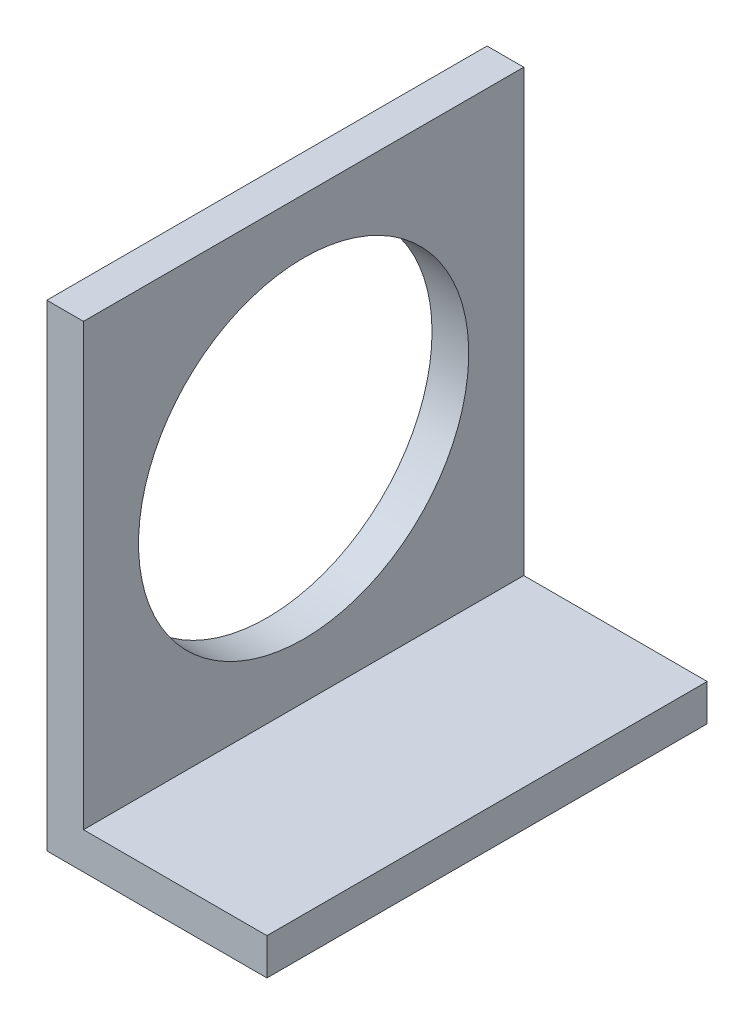
ISO-10303-21;
HEADER;
FILE_DESCRIPTION(('STEP AP214'),'2;1');
FILE_NAME('part.step','',(''),(''),'','','');
FILE_SCHEMA(('AUTOMOTIVE_DESIGN { 1 0 10303 214 1 1 1 1 }'));
ENDSEC;
DATA;
#1=APPLICATION_CONTEXT('core data for automotive mechanical design processes');
#2=APPLICATION_PROTOCOL_DEFINITION('international standard','automotive_design',2000,#1);
#3=PRODUCT_CONTEXT('',#1,'mechanical');
#4=PRODUCT('Part','Part','',(#3));
#5=PRODUCT_RELATED_PRODUCT_CATEGORY('part','',(#4));
#6=PRODUCT_DEFINITION_FORMATION('','',#4);
#7=PRODUCT_DEFINITION_CONTEXT('part definition',#1,'design');
#8=PRODUCT_DEFINITION('design','',#6,#7);
#9=PRODUCT_DEFINITION_SHAPE('','',#8);
#10=(LENGTH_UNIT() NAMED_UNIT(*) SI_UNIT(.MILLI.,.METRE.));
#11=(NAMED_UNIT(*) PLANE_ANGLE_UNIT() SI_UNIT($,.RADIAN.));
#12=(NAMED_UNIT(*) SI_UNIT($,.STERADIAN.) SOLID_ANGLE_UNIT());
#13=UNCERTAINTY_MEASURE_WITH_UNIT(LENGTH_MEASURE(1.E-05),#10,'distance_accuracy_value','');
#14=(GEOMETRIC_REPRESENTATION_CONTEXT(3) GLOBAL_UNCERTAINTY_ASSIGNED_CONTEXT((#13)) GLOBAL_UNIT_ASSIGNED_CONTEXT((#10,
#11,#12)) REPRESENTATION_CONTEXT('',''));
#15=CARTESIAN_POINT('',(0.,0.,0.));
#16=DIRECTION('',(0.,0.,1.));
#17=DIRECTION('',(1.,0.,0.));
#18=AXIS2_PLACEMENT_3D('',#15,#16,#17);
#19=CARTESIAN_POINT('',(30.,0.,60.));
#20=DIRECTION('',(0.,1.,0.));
#21=DIRECTION('',(-1.,0.,0.));
#22=AXIS2_PLACEMENT_3D('',#19,#20,#21);
#23=PLANE('',#22);
#24=DIRECTION('',(1.,0.,0.));
#25=VECTOR('',#24,1.);
#26=CARTESIAN_POINT('',(30.,0.,0.));
#27=LINE('',#26,#25);
#28=CARTESIAN_POINT('',(0.,0.,0.));
#29=VERTEX_POINT('',#28);
#30=CARTESIAN_POINT('',(30.,0.,0.));
#31=VERTEX_POINT('',#30);
#32=EDGE_CURVE('E118',#29,#31,#27,.T.);
#33=ORIENTED_EDGE('',*,*,#32,.T.);
#34=DIRECTION('',(0.,0.,-1.));
#35=VECTOR('',#34,1.);
#36=CARTESIAN_POINT('',(30.,0.,60.));
#37=LINE('',#36,#35);
#38=CARTESIAN_POINT('',(30.,0.,60.));
#39=VERTEX_POINT('',#38);
#40=EDGE_CURVE('E11',#39,#31,#37,.T.);
#41=ORIENTED_EDGE('',*,*,#40,.F.);
#42=DIRECTION('',(1.,0.,0.));
#43=VECTOR('',#42,1.);
#44=CARTESIAN_POINT('',(30.,0.,60.));
#45=LINE('',#44,#43);
#46=CARTESIAN_POINT('',(0.,0.,60.));
#47=VERTEX_POINT('',#46);
#48=EDGE_CURVE('E128',#47,#39,#45,.T.);
#49=ORIENTED_EDGE('',*,*,#48,.F.);
#50=DIRECTION('',(0.,0.,-1.));
#51=VECTOR('',#50,1.);
#52=CARTESIAN_POINT('',(0.,0.,60.));
#53=LINE('',#52,#51);
#54=EDGE_CURVE('E114',#47,#29,#53,.T.);
#55=ORIENTED_EDGE('',*,*,#54,.T.);
#56=EDGE_LOOP('',(#33,#41,#49,#55));
#57=FACE_BOUND('',#56,.T.);
#58=ADVANCED_FACE('F33',(#57),#23,.F.);
#59=CARTESIAN_POINT('',(30.,5.00000000000001,60.));
#60=DIRECTION('',(-1.,0.,0.));
#61=DIRECTION('',(0.,0.,1.));
#62=AXIS2_PLACEMENT_3D('',#59,#60,#61);
#63=PLANE('',#62);
#64=DIRECTION('',(0.,1.,0.));
#65=VECTOR('',#64,1.);
#66=CARTESIAN_POINT('',(30.,5.00000000000001,0.));
#67=LINE('',#66,#65);
#68=CARTESIAN_POINT('',(30.,5.00000000000001,0.));
#69=VERTEX_POINT('',#68);
#70=EDGE_CURVE('E121',#31,#69,#67,.T.);
#71=ORIENTED_EDGE('',*,*,#70,.T.);
#72=DIRECTION('',(0.,0.,-1.));
#73=VECTOR('',#72,1.);
#74=CARTESIAN_POINT('',(30.,5.00000000000001,60.));
#75=LINE('',#74,#73);
#76=CARTESIAN_POINT('',(30.,5.00000000000001,60.));
#77=VERTEX_POINT('',#76);
#78=EDGE_CURVE('E42',#77,#69,#75,.T.);
#79=ORIENTED_EDGE('',*,*,#78,.F.);
#80=DIRECTION('',(0.,1.,0.));
#81=VECTOR('',#80,1.);
#82=CARTESIAN_POINT('',(30.,5.00000000000001,60.));
#83=LINE('',#82,#81);
#84=EDGE_CURVE('E87',#39,#77,#83,.T.);
#85=ORIENTED_EDGE('',*,*,#84,.F.);
#86=ORIENTED_EDGE('',*,*,#40,.T.);
#87=EDGE_LOOP('',(#71,#79,#85,#86));
#88=FACE_BOUND('',#87,.T.);
#89=ADVANCED_FACE('F155',(#88),#63,.F.);
#90=CARTESIAN_POINT('',(5.,5.00000000000001,60.));
#91=DIRECTION('',(0.,-1.,0.));
#92=DIRECTION('',(1.,0.,0.));
#93=AXIS2_PLACEMENT_3D('',#90,#91,#92);
#94=PLANE('',#93);
#95=DIRECTION('',(-1.,0.,0.));
#96=VECTOR('',#95,1.);
#97=CARTESIAN_POINT('',(5.,5.00000000000001,0.));
#98=LINE('',#97,#96);
#99=CARTESIAN_POINT('',(5.,5.00000000000001,0.));
#100=VERTEX_POINT('',#99);
#101=EDGE_CURVE('E123',#69,#100,#98,.T.);
#102=ORIENTED_EDGE('',*,*,#101,.T.);
#103=DIRECTION('',(0.,0.,-1.));
#104=VECTOR('',#103,1.);
#105=CARTESIAN_POINT('',(5.,5.00000000000001,60.));
#106=LINE('',#105,#104);
#107=CARTESIAN_POINT('',(5.,5.00000000000001,60.));
#108=VERTEX_POINT('',#107);
#109=EDGE_CURVE('E109',#108,#100,#106,.T.);
#110=ORIENTED_EDGE('',*,*,#109,.F.);
#111=DIRECTION('',(-1.,0.,0.));
#112=VECTOR('',#111,1.);
#113=CARTESIAN_POINT('',(5.,5.00000000000001,60.));
#114=LINE('',#113,#112);
#115=EDGE_CURVE('E100',#77,#108,#114,.T.);
#116=ORIENTED_EDGE('',*,*,#115,.F.);
#117=ORIENTED_EDGE('',*,*,#78,.T.);
#118=EDGE_LOOP('',(#102,#110,#116,#117));
#119=FACE_BOUND('',#118,.T.);
#120=ADVANCED_FACE('F135',(#119),#94,.F.);
#121=CARTESIAN_POINT('',(4.99999999999999,65.,60.));
#122=DIRECTION('',(-1.,0.,0.));
#123=DIRECTION('',(0.,-1.,0.));
#124=AXIS2_PLACEMENT_3D('',#121,#122,#123);
#125=PLANE('',#124);
#126=CARTESIAN_POINT('',(4.99999999999999,35.,30.));
#127=DIRECTION('',(1.,0.,0.));
#128=DIRECTION('',(0.,1.,0.));
#129=AXIS2_PLACEMENT_3D('',#126,#127,#128);
#130=CIRCLE('',#129,22.5);
#131=CARTESIAN_POINT('',(4.99999999999999,57.5,30.));
#132=VERTEX_POINT('',#131);
#133=EDGE_CURVE('E170',#132,#132,#130,.T.);
#134=ORIENTED_EDGE('',*,*,#133,.F.);
#135=EDGE_LOOP('',(#134));
#136=FACE_BOUND('',#135,.T.);
#137=DIRECTION('',(0.,1.,0.));
#138=VECTOR('',#137,1.);
#139=CARTESIAN_POINT('',(4.99999999999999,65.,0.));
#140=LINE('',#139,#138);
#141=CARTESIAN_POINT('',(4.99999999999999,65.,0.));
#142=VERTEX_POINT('',#141);
#143=EDGE_CURVE('E108',#100,#142,#140,.T.);
#144=ORIENTED_EDGE('',*,*,#143,.T.);
#145=DIRECTION('',(0.,0.,-1.));
#146=VECTOR('',#145,1.);
#147=CARTESIAN_POINT('',(4.99999999999999,65.,60.));
#148=LINE('',#147,#146);
#149=CARTESIAN_POINT('',(4.99999999999999,65.,60.));
#150=VERTEX_POINT('',#149);
#151=EDGE_CURVE('E105',#150,#142,#148,.T.);
#152=ORIENTED_EDGE('',*,*,#151,.F.);
#153=DIRECTION('',(0.,1.,0.));
#154=VECTOR('',#153,1.);
#155=CARTESIAN_POINT('',(4.99999999999999,65.,60.));
#156=LINE('',#155,#154);
#157=EDGE_CURVE('E94',#108,#150,#156,.T.);
#158=ORIENTED_EDGE('',*,*,#157,.F.);
#159=ORIENTED_EDGE('',*,*,#109,.T.);
#160=EDGE_LOOP('',(#144,#152,#158,#159));
#161=FACE_BOUND('',#160,.T.);
#162=ADVANCED_FACE('F106',(#136,#161),#125,.F.);
#163=CARTESIAN_POINT('',(0.,65.,60.));
#164=DIRECTION('',(0.,-1.,0.));
#165=DIRECTION('',(1.,0.,0.));
#166=AXIS2_PLACEMENT_3D('',#163,#164,#165);
#167=PLANE('',#166);
#168=DIRECTION('',(-1.,0.,0.));
#169=VECTOR('',#168,1.);
#170=CARTESIAN_POINT('',(0.,65.,0.));
#171=LINE('',#170,#169);
#172=CARTESIAN_POINT('',(0.,65.,0.));
#173=VERTEX_POINT('',#172);
#174=EDGE_CURVE('E73',#142,#173,#171,.T.);
#175=ORIENTED_EDGE('',*,*,#174,.T.);
#176=DIRECTION('',(0.,0.,-1.));
#177=VECTOR('',#176,1.);
#178=CARTESIAN_POINT('',(0.,65.,60.));
#179=LINE('',#178,#177);
#180=CARTESIAN_POINT('',(0.,65.,60.));
#181=VERTEX_POINT('',#180);
#182=EDGE_CURVE('E110',#181,#173,#179,.T.);
#183=ORIENTED_EDGE('',*,*,#182,.F.);
#184=DIRECTION('',(-1.,0.,0.));
#185=VECTOR('',#184,1.);
#186=CARTESIAN_POINT('',(0.,65.,60.));
#187=LINE('',#186,#185);
#188=EDGE_CURVE('E98',#150,#181,#187,.T.);
#189=ORIENTED_EDGE('',*,*,#188,.F.);
#190=ORIENTED_EDGE('',*,*,#151,.T.);
#191=EDGE_LOOP('',(#175,#183,#189,#190));
#192=FACE_BOUND('',#191,.T.);
#193=ADVANCED_FACE('F112',(#192),#167,.F.);
#194=CARTESIAN_POINT('',(0.,0.,60.));
#195=DIRECTION('',(1.,0.,0.));
#196=DIRECTION('',(0.,0.,-1.));
#197=AXIS2_PLACEMENT_3D('',#194,#195,#196);
#198=PLANE('',#197);
#199=CARTESIAN_POINT('',(0.,35.,30.));
#200=DIRECTION('',(1.,0.,0.));
#201=DIRECTION('',(0.,0.,-1.));
#202=AXIS2_PLACEMENT_3D('',#199,#200,#201);
#203=CIRCLE('',#202,22.5);
#204=CARTESIAN_POINT('',(0.,35.,7.5));
#205=VERTEX_POINT('',#204);
#206=EDGE_CURVE('E36',#205,#205,#203,.T.);
#207=ORIENTED_EDGE('',*,*,#206,.T.);
#208=EDGE_LOOP('',(#207));
#209=FACE_BOUND('',#208,.T.);
#210=DIRECTION('',(0.,-1.,0.));
#211=VECTOR('',#210,1.);
#212=CARTESIAN_POINT('',(0.,0.,0.));
#213=LINE('',#212,#211);
#214=EDGE_CURVE('E79',#173,#29,#213,.T.);
#215=ORIENTED_EDGE('',*,*,#214,.T.);
#216=ORIENTED_EDGE('',*,*,#54,.F.);
#217=DIRECTION('',(0.,-1.,0.));
#218=VECTOR('',#217,1.);
#219=CARTESIAN_POINT('',(0.,0.,60.));
#220=LINE('',#219,#218);
#221=EDGE_CURVE('E50',#181,#47,#220,.T.);
#222=ORIENTED_EDGE('',*,*,#221,.F.);
#223=ORIENTED_EDGE('',*,*,#182,.T.);
#224=EDGE_LOOP('',(#215,#216,#222,#223));
#225=FACE_BOUND('',#224,.T.);
#226=ADVANCED_FACE('F142',(#209,#225),#198,.F.);
#227=CARTESIAN_POINT('',(0.,0.,60.));
#228=DIRECTION('',(0.,0.,-1.));
#229=DIRECTION('',(-1.,0.,0.));
#230=AXIS2_PLACEMENT_3D('',#227,#228,#229);
#231=PLANE('',#230);
#232=ORIENTED_EDGE('',*,*,#48,.T.);
#233=ORIENTED_EDGE('',*,*,#84,.T.);
#234=ORIENTED_EDGE('',*,*,#115,.T.);
#235=ORIENTED_EDGE('',*,*,#157,.T.);
#236=ORIENTED_EDGE('',*,*,#188,.T.);
#237=ORIENTED_EDGE('',*,*,#221,.T.);
#238=EDGE_LOOP('',(#232,#233,#234,#235,#236,#237));
#239=FACE_BOUND('',#238,.T.);
#240=ADVANCED_FACE('F96',(#239),#231,.F.);
#241=CARTESIAN_POINT('',(0.,0.,0.));
#242=DIRECTION('',(0.,0.,-1.));
#243=DIRECTION('',(-1.,0.,0.));
#244=AXIS2_PLACEMENT_3D('',#241,#242,#243);
#245=PLANE('',#244);
#246=ORIENTED_EDGE('',*,*,#32,.F.);
#247=ORIENTED_EDGE('',*,*,#214,.F.);
#248=ORIENTED_EDGE('',*,*,#174,.F.);
#249=ORIENTED_EDGE('',*,*,#143,.F.);
#250=ORIENTED_EDGE('',*,*,#101,.F.);
#251=ORIENTED_EDGE('',*,*,#70,.F.);
#252=EDGE_LOOP('',(#246,#247,#248,#249,#250,#251));
#253=FACE_BOUND('',#252,.T.);
#254=ADVANCED_FACE('F138',(#253),#245,.T.);
#255=CARTESIAN_POINT('',(-55.,35.,30.));
#256=DIRECTION('',(1.,0.,0.));
#257=DIRECTION('',(0.,1.,0.));
#258=AXIS2_PLACEMENT_3D('',#255,#256,#257);
#259=CYLINDRICAL_SURFACE('',#258,22.5);
#260=ORIENTED_EDGE('',*,*,#133,.T.);
#261=EDGE_LOOP('',(#260));
#262=FACE_BOUND('',#261,.T.);
#263=ORIENTED_EDGE('',*,*,#206,.F.);
#264=EDGE_LOOP('',(#263));
#265=FACE_BOUND('',#264,.T.);
#266=ADVANCED_FACE('F177',(#262,#265),#259,.F.);
#267=CLOSED_SHELL('',(#58,#89,#120,#162,#193,#226,#240,#254,#266));
#268=MANIFOLD_SOLID_BREP('B2',#267);
#269=ADVANCED_BREP_SHAPE_REPRESENTATION('',(#18,#268),#14);
#270=SHAPE_DEFINITION_REPRESENTATION(#9,#269);
ENDSEC;
END-ISO-10303-21;
